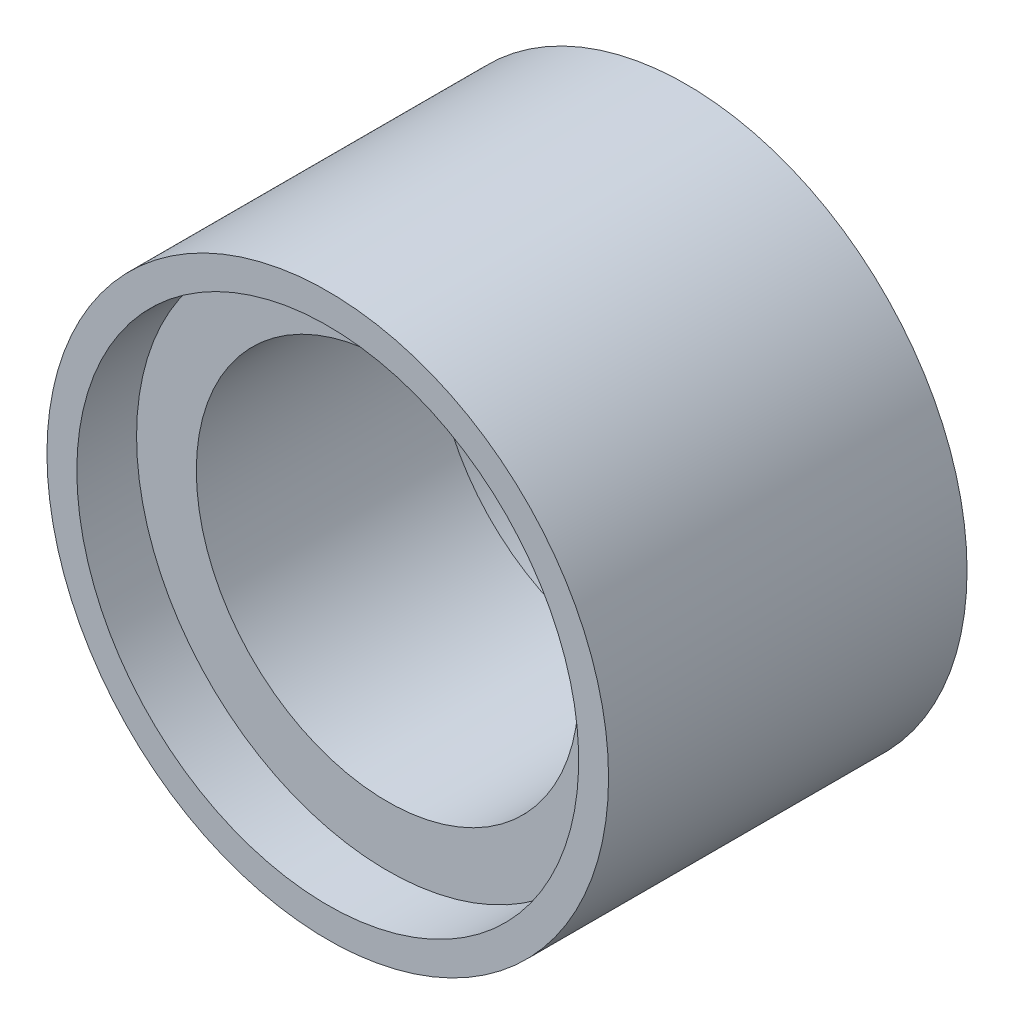
ISO-10303-21;
HEADER;
FILE_DESCRIPTION(('STEP AP214'),'2;1');
FILE_NAME('part.step','',(''),(''),'','','');
FILE_SCHEMA(('AUTOMOTIVE_DESIGN { 1 0 10303 214 1 1 1 1 }'));
ENDSEC;
DATA;
#1=APPLICATION_CONTEXT('core data for automotive mechanical design processes');
#2=APPLICATION_PROTOCOL_DEFINITION('international standard','automotive_design',2000,#1);
#3=PRODUCT_CONTEXT('',#1,'mechanical');
#4=PRODUCT('Part','Part','',(#3));
#5=PRODUCT_RELATED_PRODUCT_CATEGORY('part','',(#4));
#6=PRODUCT_DEFINITION_FORMATION('','',#4);
#7=PRODUCT_DEFINITION_CONTEXT('part definition',#1,'design');
#8=PRODUCT_DEFINITION('design','',#6,#7);
#9=PRODUCT_DEFINITION_SHAPE('','',#8);
#10=(LENGTH_UNIT() NAMED_UNIT(*) SI_UNIT(.MILLI.,.METRE.));
#11=(NAMED_UNIT(*) PLANE_ANGLE_UNIT() SI_UNIT($,.RADIAN.));
#12=(NAMED_UNIT(*) SI_UNIT($,.STERADIAN.) SOLID_ANGLE_UNIT());
#13=UNCERTAINTY_MEASURE_WITH_UNIT(LENGTH_MEASURE(1.E-05),#10,'distance_accuracy_value','');
#14=(GEOMETRIC_REPRESENTATION_CONTEXT(3) GLOBAL_UNCERTAINTY_ASSIGNED_CONTEXT((#13)) GLOBAL_UNIT_ASSIGNED_CONTEXT((#10,
#11,#12)) REPRESENTATION_CONTEXT('',''));
#15=CARTESIAN_POINT('',(0.,0.,0.));
#16=DIRECTION('',(0.,0.,1.));
#17=DIRECTION('',(1.,0.,0.));
#18=AXIS2_PLACEMENT_3D('',#15,#16,#17);
#19=CARTESIAN_POINT('',(0.,0.,10.));
#20=DIRECTION('',(0.,0.,1.));
#21=DIRECTION('',(1.,0.,0.));
#22=AXIS2_PLACEMENT_3D('',#19,#20,#21);
#23=PLANE('',#22);
#24=CARTESIAN_POINT('',(0.,0.,10.));
#25=DIRECTION('',(0.,0.,1.));
#26=DIRECTION('',(1.,0.,0.));
#27=AXIS2_PLACEMENT_3D('',#24,#25,#26);
#28=CIRCLE('',#27,16.);
#29=CARTESIAN_POINT('',(16.,0.,10.));
#30=VERTEX_POINT('',#29);
#31=EDGE_CURVE('E10',#30,#30,#28,.T.);
#32=ORIENTED_EDGE('',*,*,#31,.F.);
#33=EDGE_LOOP('',(#32));
#34=FACE_BOUND('',#33,.T.);
#35=CARTESIAN_POINT('',(0.,0.,10.));
#36=DIRECTION('',(0.,0.,-1.));
#37=DIRECTION('',(-1.,0.,0.));
#38=AXIS2_PLACEMENT_3D('',#35,#36,#37);
#39=CIRCLE('',#38,21.);
#40=CARTESIAN_POINT('',(-21.,0.,10.));
#41=VERTEX_POINT('',#40);
#42=EDGE_CURVE('E58',#41,#41,#39,.T.);
#43=ORIENTED_EDGE('',*,*,#42,.F.);
#44=EDGE_LOOP('',(#43));
#45=FACE_BOUND('',#44,.T.);
#46=ADVANCED_FACE('F33',(#34,#45),#23,.T.);
#47=CARTESIAN_POINT('',(0.,0.,-10.));
#48=DIRECTION('',(0.,0.,1.));
#49=DIRECTION('',(1.,0.,0.));
#50=AXIS2_PLACEMENT_3D('',#47,#48,#49);
#51=PLANE('',#50);
#52=CARTESIAN_POINT('',(0.,0.,-10.));
#53=DIRECTION('',(0.,0.,1.));
#54=DIRECTION('',(1.,0.,0.));
#55=AXIS2_PLACEMENT_3D('',#52,#53,#54);
#56=CIRCLE('',#55,16.);
#57=CARTESIAN_POINT('',(16.,0.,-10.));
#58=VERTEX_POINT('',#57);
#59=EDGE_CURVE('E37',#58,#58,#56,.T.);
#60=ORIENTED_EDGE('',*,*,#59,.T.);
#61=EDGE_LOOP('',(#60));
#62=FACE_BOUND('',#61,.T.);
#63=CARTESIAN_POINT('',(0.,0.,-10.));
#64=DIRECTION('',(0.,0.,-1.));
#65=DIRECTION('',(-1.,0.,0.));
#66=AXIS2_PLACEMENT_3D('',#63,#64,#65);
#67=CIRCLE('',#66,21.);
#68=CARTESIAN_POINT('',(-21.,0.,-10.));
#69=VERTEX_POINT('',#68);
#70=EDGE_CURVE('E49',#69,#69,#67,.T.);
#71=ORIENTED_EDGE('',*,*,#70,.T.);
#72=EDGE_LOOP('',(#71));
#73=FACE_BOUND('',#72,.T.);
#74=ADVANCED_FACE('F74',(#62,#73),#51,.F.);
#75=CARTESIAN_POINT('',(0.,0.,10.));
#76=DIRECTION('',(0.,0.,-1.));
#77=DIRECTION('',(-1.,0.,0.));
#78=AXIS2_PLACEMENT_3D('',#75,#76,#77);
#79=CYLINDRICAL_SURFACE('',#78,23.5);
#80=CARTESIAN_POINT('',(0.,0.,-15.));
#81=DIRECTION('',(0.,0.,-1.));
#82=DIRECTION('',(-1.,0.,0.));
#83=AXIS2_PLACEMENT_3D('',#80,#81,#82);
#84=CIRCLE('',#83,23.5);
#85=CARTESIAN_POINT('',(-23.5,0.,-15.));
#86=VERTEX_POINT('',#85);
#87=EDGE_CURVE('E44',#86,#86,#84,.T.);
#88=ORIENTED_EDGE('',*,*,#87,.F.);
#89=EDGE_LOOP('',(#88));
#90=FACE_BOUND('',#89,.T.);
#91=CARTESIAN_POINT('',(0.,0.,15.));
#92=DIRECTION('',(0.,0.,-1.));
#93=DIRECTION('',(-1.,0.,0.));
#94=AXIS2_PLACEMENT_3D('',#91,#92,#93);
#95=CIRCLE('',#94,23.5);
#96=CARTESIAN_POINT('',(-23.5,0.,15.));
#97=VERTEX_POINT('',#96);
#98=EDGE_CURVE('E52',#97,#97,#95,.T.);
#99=ORIENTED_EDGE('',*,*,#98,.T.);
#100=EDGE_LOOP('',(#99));
#101=FACE_BOUND('',#100,.T.);
#102=ADVANCED_FACE('F35',(#90,#101),#79,.T.);
#103=CARTESIAN_POINT('',(0.,0.,10.));
#104=DIRECTION('',(0.,0.,-1.));
#105=DIRECTION('',(-1.,0.,0.));
#106=AXIS2_PLACEMENT_3D('',#103,#104,#105);
#107=CYLINDRICAL_SURFACE('',#106,16.);
#108=ORIENTED_EDGE('',*,*,#31,.T.);
#109=EDGE_LOOP('',(#108));
#110=FACE_BOUND('',#109,.T.);
#111=ORIENTED_EDGE('',*,*,#59,.F.);
#112=EDGE_LOOP('',(#111));
#113=FACE_BOUND('',#112,.T.);
#114=ADVANCED_FACE('F82',(#110,#113),#107,.F.);
#115=CARTESIAN_POINT('',(0.,0.,-15.));
#116=DIRECTION('',(0.,0.,-1.));
#117=DIRECTION('',(-1.,0.,0.));
#118=AXIS2_PLACEMENT_3D('',#115,#116,#117);
#119=PLANE('',#118);
#120=ORIENTED_EDGE('',*,*,#87,.T.);
#121=EDGE_LOOP('',(#120));
#122=FACE_BOUND('',#121,.T.);
#123=CARTESIAN_POINT('',(0.,0.,-15.));
#124=DIRECTION('',(0.,0.,-1.));
#125=DIRECTION('',(-1.,0.,0.));
#126=AXIS2_PLACEMENT_3D('',#123,#124,#125);
#127=CIRCLE('',#126,21.);
#128=CARTESIAN_POINT('',(-21.,0.,-15.));
#129=VERTEX_POINT('',#128);
#130=EDGE_CURVE('E48',#129,#129,#127,.T.);
#131=ORIENTED_EDGE('',*,*,#130,.F.);
#132=EDGE_LOOP('',(#131));
#133=FACE_BOUND('',#132,.T.);
#134=ADVANCED_FACE('F85',(#122,#133),#119,.T.);
#135=CARTESIAN_POINT('',(0.,0.,-15.));
#136=DIRECTION('',(0.,0.,1.));
#137=DIRECTION('',(1.,0.,0.));
#138=AXIS2_PLACEMENT_3D('',#135,#136,#137);
#139=CYLINDRICAL_SURFACE('',#138,21.);
#140=ORIENTED_EDGE('',*,*,#130,.T.);
#141=EDGE_LOOP('',(#140));
#142=FACE_BOUND('',#141,.T.);
#143=ORIENTED_EDGE('',*,*,#70,.F.);
#144=EDGE_LOOP('',(#143));
#145=FACE_BOUND('',#144,.T.);
#146=ADVANCED_FACE('F88',(#142,#145),#139,.F.);
#147=CARTESIAN_POINT('',(0.,0.,15.));
#148=DIRECTION('',(0.,0.,1.));
#149=DIRECTION('',(-1.,0.,0.));
#150=AXIS2_PLACEMENT_3D('',#147,#148,#149);
#151=PLANE('',#150);
#152=CARTESIAN_POINT('',(0.,0.,15.));
#153=DIRECTION('',(0.,0.,-1.));
#154=DIRECTION('',(-1.,0.,0.));
#155=AXIS2_PLACEMENT_3D('',#152,#153,#154);
#156=CIRCLE('',#155,21.);
#157=CARTESIAN_POINT('',(-21.,0.,15.));
#158=VERTEX_POINT('',#157);
#159=EDGE_CURVE('E57',#158,#158,#156,.T.);
#160=ORIENTED_EDGE('',*,*,#159,.T.);
#161=EDGE_LOOP('',(#160));
#162=FACE_BOUND('',#161,.T.);
#163=ORIENTED_EDGE('',*,*,#98,.F.);
#164=EDGE_LOOP('',(#163));
#165=FACE_BOUND('',#164,.T.);
#166=ADVANCED_FACE('F64',(#162,#165),#151,.T.);
#167=CARTESIAN_POINT('',(0.,0.,15.));
#168=DIRECTION('',(0.,0.,-1.));
#169=DIRECTION('',(-1.,0.,0.));
#170=AXIS2_PLACEMENT_3D('',#167,#168,#169);
#171=CYLINDRICAL_SURFACE('',#170,21.);
#172=ORIENTED_EDGE('',*,*,#159,.F.);
#173=EDGE_LOOP('',(#172));
#174=FACE_BOUND('',#173,.T.);
#175=ORIENTED_EDGE('',*,*,#42,.T.);
#176=EDGE_LOOP('',(#175));
#177=FACE_BOUND('',#176,.T.);
#178=ADVANCED_FACE('F67',(#174,#177),#171,.F.);
#179=CLOSED_SHELL('',(#46,#74,#102,#114,#134,#146,#166,#178));
#180=MANIFOLD_SOLID_BREP('B2',#179);
#181=ADVANCED_BREP_SHAPE_REPRESENTATION('',(#18,#180),#14);
#182=SHAPE_DEFINITION_REPRESENTATION(#9,#181);
ENDSEC;
END-ISO-10303-21;
